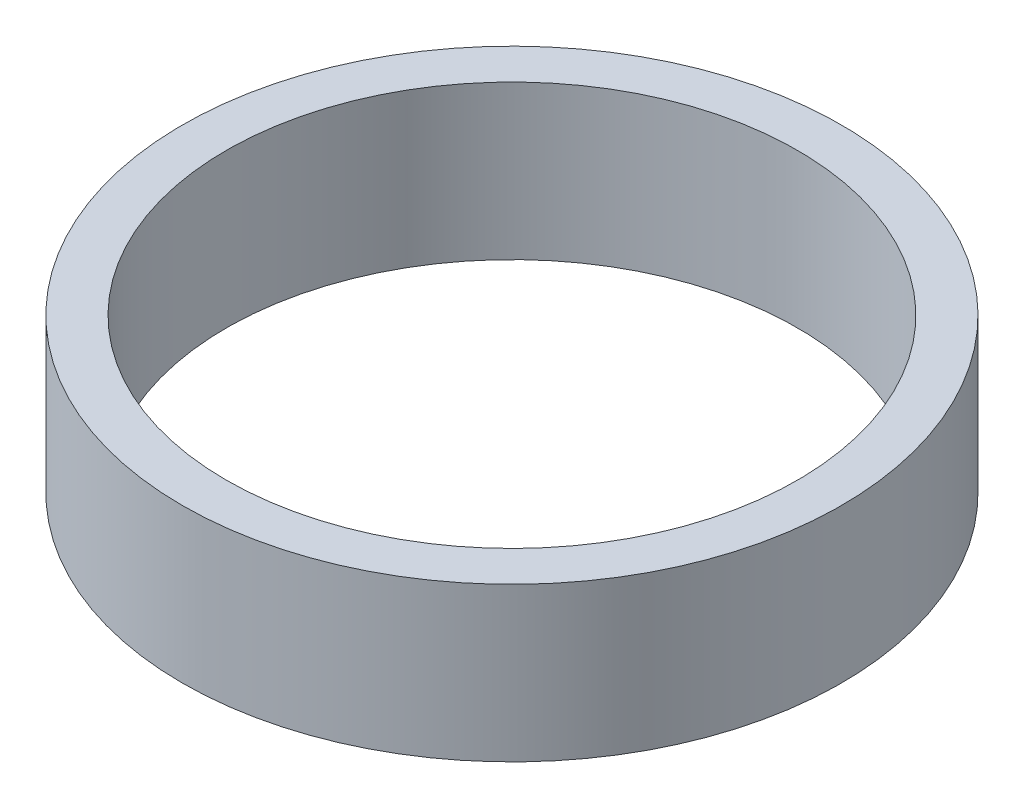
ISO-10303-21;
HEADER;
FILE_DESCRIPTION(('STEP AP214'),'2;1');
FILE_NAME('part.step','',(''),(''),'','','');
FILE_SCHEMA(('AUTOMOTIVE_DESIGN { 1 0 10303 214 1 1 1 1 }'));
ENDSEC;
DATA;
#1=APPLICATION_CONTEXT('core data for automotive mechanical design processes');
#2=APPLICATION_PROTOCOL_DEFINITION('international standard','automotive_design',2000,#1);
#3=PRODUCT_CONTEXT('',#1,'mechanical');
#4=PRODUCT('Part','Part','',(#3));
#5=PRODUCT_RELATED_PRODUCT_CATEGORY('part','',(#4));
#6=PRODUCT_DEFINITION_FORMATION('','',#4);
#7=PRODUCT_DEFINITION_CONTEXT('part definition',#1,'design');
#8=PRODUCT_DEFINITION('design','',#6,#7);
#9=PRODUCT_DEFINITION_SHAPE('','',#8);
#10=(LENGTH_UNIT() NAMED_UNIT(*) SI_UNIT(.MILLI.,.METRE.));
#11=(NAMED_UNIT(*) PLANE_ANGLE_UNIT() SI_UNIT($,.RADIAN.));
#12=(NAMED_UNIT(*) SI_UNIT($,.STERADIAN.) SOLID_ANGLE_UNIT());
#13=UNCERTAINTY_MEASURE_WITH_UNIT(LENGTH_MEASURE(1.E-05),#10,'distance_accuracy_value','');
#14=(GEOMETRIC_REPRESENTATION_CONTEXT(3) GLOBAL_UNCERTAINTY_ASSIGNED_CONTEXT((#13)) GLOBAL_UNIT_ASSIGNED_CONTEXT((#10,
#11,#12)) REPRESENTATION_CONTEXT('',''));
#15=CARTESIAN_POINT('',(0.,0.,0.));
#16=DIRECTION('',(0.,0.,1.));
#17=DIRECTION('',(1.,0.,0.));
#18=AXIS2_PLACEMENT_3D('',#15,#16,#17);
#19=CARTESIAN_POINT('',(0.,70.,0.));
#20=DIRECTION('',(0.,1.,0.));
#21=DIRECTION('',(0.,0.,1.));
#22=AXIS2_PLACEMENT_3D('',#19,#20,#21);
#23=PLANE('',#22);
#24=CARTESIAN_POINT('',(0.,70.,0.));
#25=DIRECTION('',(0.,1.,0.));
#26=DIRECTION('',(0.,0.,1.));
#27=AXIS2_PLACEMENT_3D('',#24,#25,#26);
#28=CIRCLE('',#27,150.);
#29=CARTESIAN_POINT('',(0.,70.,150.));
#30=VERTEX_POINT('',#29);
#31=EDGE_CURVE('E10',#30,#30,#28,.T.);
#32=ORIENTED_EDGE('',*,*,#31,.T.);
#33=EDGE_LOOP('',(#32));
#34=FACE_BOUND('',#33,.T.);
#35=CARTESIAN_POINT('',(0.,70.,0.));
#36=DIRECTION('',(0.,1.,0.));
#37=DIRECTION('',(0.,0.,1.));
#38=AXIS2_PLACEMENT_3D('',#35,#36,#37);
#39=CIRCLE('',#38,130.);
#40=CARTESIAN_POINT('',(0.,70.,130.));
#41=VERTEX_POINT('',#40);
#42=EDGE_CURVE('E42',#41,#41,#39,.T.);
#43=ORIENTED_EDGE('',*,*,#42,.F.);
#44=EDGE_LOOP('',(#43));
#45=FACE_BOUND('',#44,.T.);
#46=ADVANCED_FACE('F31',(#34,#45),#23,.T.);
#47=CARTESIAN_POINT('',(0.,0.,0.));
#48=DIRECTION('',(0.,1.,0.));
#49=DIRECTION('',(0.,0.,1.));
#50=AXIS2_PLACEMENT_3D('',#47,#48,#49);
#51=PLANE('',#50);
#52=CARTESIAN_POINT('',(0.,0.,0.));
#53=DIRECTION('',(0.,1.,0.));
#54=DIRECTION('',(0.,0.,1.));
#55=AXIS2_PLACEMENT_3D('',#52,#53,#54);
#56=CIRCLE('',#55,150.);
#57=CARTESIAN_POINT('',(0.,0.,150.));
#58=VERTEX_POINT('',#57);
#59=EDGE_CURVE('E35',#58,#58,#56,.T.);
#60=ORIENTED_EDGE('',*,*,#59,.F.);
#61=EDGE_LOOP('',(#60));
#62=FACE_BOUND('',#61,.T.);
#63=CARTESIAN_POINT('',(0.,0.,0.));
#64=DIRECTION('',(0.,1.,0.));
#65=DIRECTION('',(0.,0.,1.));
#66=AXIS2_PLACEMENT_3D('',#63,#64,#65);
#67=CIRCLE('',#66,130.);
#68=CARTESIAN_POINT('',(0.,0.,130.));
#69=VERTEX_POINT('',#68);
#70=EDGE_CURVE('E44',#69,#69,#67,.T.);
#71=ORIENTED_EDGE('',*,*,#70,.T.);
#72=EDGE_LOOP('',(#71));
#73=FACE_BOUND('',#72,.T.);
#74=ADVANCED_FACE('F54',(#62,#73),#51,.F.);
#75=CARTESIAN_POINT('',(0.,70.,0.));
#76=DIRECTION('',(0.,-1.,0.));
#77=DIRECTION('',(0.,0.,-1.));
#78=AXIS2_PLACEMENT_3D('',#75,#76,#77);
#79=CYLINDRICAL_SURFACE('',#78,150.);
#80=ORIENTED_EDGE('',*,*,#31,.F.);
#81=EDGE_LOOP('',(#80));
#82=FACE_BOUND('',#81,.T.);
#83=ORIENTED_EDGE('',*,*,#59,.T.);
#84=EDGE_LOOP('',(#83));
#85=FACE_BOUND('',#84,.T.);
#86=ADVANCED_FACE('F33',(#82,#85),#79,.T.);
#87=CARTESIAN_POINT('',(0.,70.,0.));
#88=DIRECTION('',(0.,-1.,0.));
#89=DIRECTION('',(0.,0.,-1.));
#90=AXIS2_PLACEMENT_3D('',#87,#88,#89);
#91=CYLINDRICAL_SURFACE('',#90,130.);
#92=ORIENTED_EDGE('',*,*,#42,.T.);
#93=EDGE_LOOP('',(#92));
#94=FACE_BOUND('',#93,.T.);
#95=ORIENTED_EDGE('',*,*,#70,.F.);
#96=EDGE_LOOP('',(#95));
#97=FACE_BOUND('',#96,.T.);
#98=ADVANCED_FACE('F50',(#94,#97),#91,.F.);
#99=CLOSED_SHELL('',(#46,#74,#86,#98));
#100=MANIFOLD_SOLID_BREP('B2',#99);
#101=ADVANCED_BREP_SHAPE_REPRESENTATION('',(#18,#100),#14);
#102=SHAPE_DEFINITION_REPRESENTATION(#9,#101);
ENDSEC;
END-ISO-10303-21;
